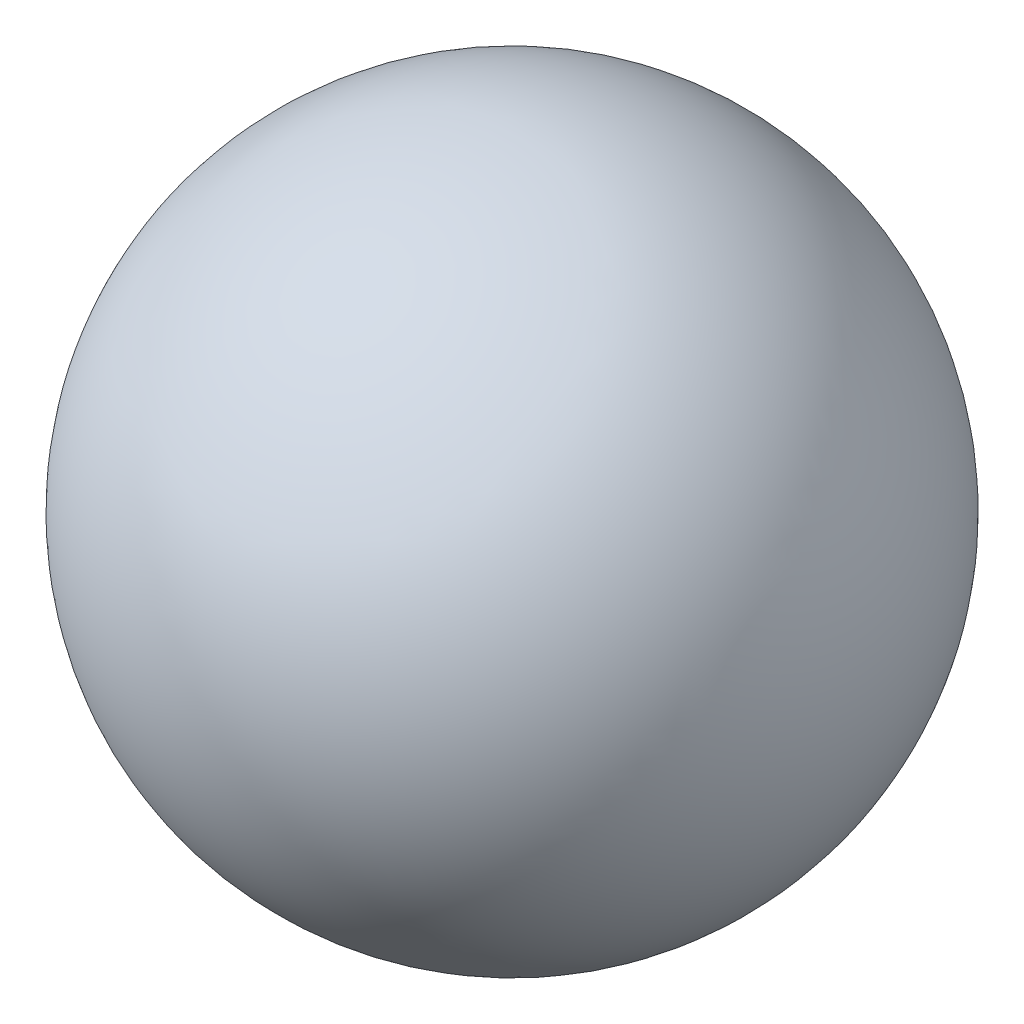
ISO-10303-21;
HEADER;
FILE_DESCRIPTION(('STEP AP214'),'2;1');
FILE_NAME('part.step','',(''),(''),'','','');
FILE_SCHEMA(('AUTOMOTIVE_DESIGN { 1 0 10303 214 1 1 1 1 }'));
ENDSEC;
DATA;
#1=APPLICATION_CONTEXT('core data for automotive mechanical design processes');
#2=APPLICATION_PROTOCOL_DEFINITION('international standard','automotive_design',2000,#1);
#3=PRODUCT_CONTEXT('',#1,'mechanical');
#4=PRODUCT('Part','Part','',(#3));
#5=PRODUCT_RELATED_PRODUCT_CATEGORY('part','',(#4));
#6=PRODUCT_DEFINITION_FORMATION('','',#4);
#7=PRODUCT_DEFINITION_CONTEXT('part definition',#1,'design');
#8=PRODUCT_DEFINITION('design','',#6,#7);
#9=PRODUCT_DEFINITION_SHAPE('','',#8);
#10=(LENGTH_UNIT() NAMED_UNIT(*) SI_UNIT(.MILLI.,.METRE.));
#11=(NAMED_UNIT(*) PLANE_ANGLE_UNIT() SI_UNIT($,.RADIAN.));
#12=(NAMED_UNIT(*) SI_UNIT($,.STERADIAN.) SOLID_ANGLE_UNIT());
#13=UNCERTAINTY_MEASURE_WITH_UNIT(LENGTH_MEASURE(1.E-05),#10,'distance_accuracy_value','');
#14=(GEOMETRIC_REPRESENTATION_CONTEXT(3) GLOBAL_UNCERTAINTY_ASSIGNED_CONTEXT((#13)) GLOBAL_UNIT_ASSIGNED_CONTEXT((#10,
#11,#12)) REPRESENTATION_CONTEXT('',''));
#15=CARTESIAN_POINT('',(0.,0.,0.));
#16=DIRECTION('',(0.,0.,1.));
#17=DIRECTION('',(1.,0.,0.));
#18=AXIS2_PLACEMENT_3D('',#15,#16,#17);
#19=CARTESIAN_POINT('',(0.,22.5,0.));
#20=DIRECTION('',(1.,0.,0.));
#21=DIRECTION('',(0.,1.,0.));
#22=AXIS2_PLACEMENT_3D('',#19,#20,#21);
#23=SPHERICAL_SURFACE('',#22,2.85714285714286);
#24=CARTESIAN_POINT('',(2.85714285714286,22.5,0.));
#25=VERTEX_POINT('',#24);
#26=VERTEX_LOOP('',#25);
#27=FACE_BOUND('',#26,.T.);
#28=ADVANCED_FACE('F346',(#27),#23,.T.);
#29=CLOSED_SHELL('',(#28));
#30=MANIFOLD_SOLID_BREP('B2',#29);
#31=ADVANCED_BREP_SHAPE_REPRESENTATION('',(#18,#30),#14);
#32=SHAPE_DEFINITION_REPRESENTATION(#9,#31);
ENDSEC;
END-ISO-10303-21;
